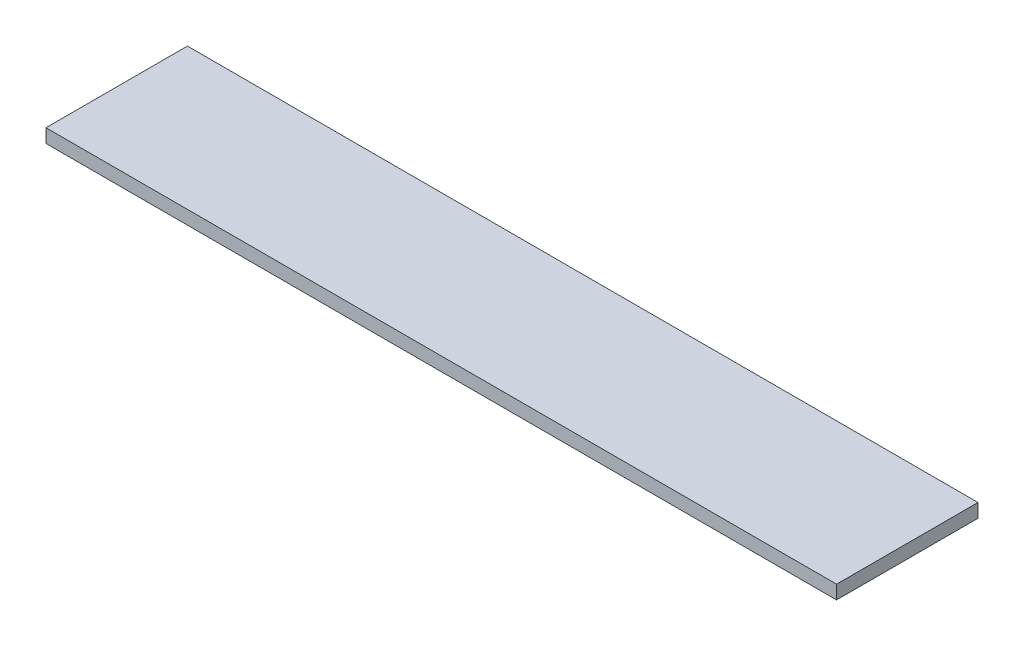
ISO-10303-21;
HEADER;
FILE_DESCRIPTION(('STEP AP214'),'2;1');
FILE_NAME('part.step','',(''),(''),'','','');
FILE_SCHEMA(('AUTOMOTIVE_DESIGN { 1 0 10303 214 1 1 1 1 }'));
ENDSEC;
DATA;
#1=APPLICATION_CONTEXT('core data for automotive mechanical design processes');
#2=APPLICATION_PROTOCOL_DEFINITION('international standard','automotive_design',2000,#1);
#3=PRODUCT_CONTEXT('',#1,'mechanical');
#4=PRODUCT('Part','Part','',(#3));
#5=PRODUCT_RELATED_PRODUCT_CATEGORY('part','',(#4));
#6=PRODUCT_DEFINITION_FORMATION('','',#4);
#7=PRODUCT_DEFINITION_CONTEXT('part definition',#1,'design');
#8=PRODUCT_DEFINITION('design','',#6,#7);
#9=PRODUCT_DEFINITION_SHAPE('','',#8);
#10=(LENGTH_UNIT() NAMED_UNIT(*) SI_UNIT(.MILLI.,.METRE.));
#11=(NAMED_UNIT(*) PLANE_ANGLE_UNIT() SI_UNIT($,.RADIAN.));
#12=(NAMED_UNIT(*) SI_UNIT($,.STERADIAN.) SOLID_ANGLE_UNIT());
#13=UNCERTAINTY_MEASURE_WITH_UNIT(LENGTH_MEASURE(1.E-05),#10,'distance_accuracy_value','');
#14=(GEOMETRIC_REPRESENTATION_CONTEXT(3) GLOBAL_UNCERTAINTY_ASSIGNED_CONTEXT((#13)) GLOBAL_UNIT_ASSIGNED_CONTEXT((#10,
#11,#12)) REPRESENTATION_CONTEXT('',''));
#15=CARTESIAN_POINT('',(0.,0.,0.));
#16=DIRECTION('',(0.,0.,1.));
#17=DIRECTION('',(1.,0.,0.));
#18=AXIS2_PLACEMENT_3D('',#15,#16,#17);
#19=CARTESIAN_POINT('',(57.85,2.,-10.35));
#20=DIRECTION('',(-1.,0.,0.));
#21=DIRECTION('',(0.,0.,1.));
#22=AXIS2_PLACEMENT_3D('',#19,#20,#21);
#23=PLANE('',#22);
#24=DIRECTION('',(0.,0.,-1.));
#25=VECTOR('',#24,1.);
#26=CARTESIAN_POINT('',(57.85,0.,-10.35));
#27=LINE('',#26,#25);
#28=CARTESIAN_POINT('',(57.85,0.,10.35));
#29=VERTEX_POINT('',#28);
#30=CARTESIAN_POINT('',(57.85,0.,-10.35));
#31=VERTEX_POINT('',#30);
#32=EDGE_CURVE('E98',#29,#31,#27,.T.);
#33=ORIENTED_EDGE('',*,*,#32,.T.);
#34=DIRECTION('',(0.,-1.,0.));
#35=VECTOR('',#34,1.);
#36=CARTESIAN_POINT('',(57.85,2.,-10.35));
#37=LINE('',#36,#35);
#38=CARTESIAN_POINT('',(57.85,2.,-10.35));
#39=VERTEX_POINT('',#38);
#40=EDGE_CURVE('E11',#39,#31,#37,.T.);
#41=ORIENTED_EDGE('',*,*,#40,.F.);
#42=DIRECTION('',(0.,0.,-1.));
#43=VECTOR('',#42,1.);
#44=CARTESIAN_POINT('',(57.85,2.,-10.35));
#45=LINE('',#44,#43);
#46=CARTESIAN_POINT('',(57.85,2.,10.35));
#47=VERTEX_POINT('',#46);
#48=EDGE_CURVE('E86',#47,#39,#45,.T.);
#49=ORIENTED_EDGE('',*,*,#48,.F.);
#50=DIRECTION('',(0.,-1.,0.));
#51=VECTOR('',#50,1.);
#52=CARTESIAN_POINT('',(57.85,2.,10.35));
#53=LINE('',#52,#51);
#54=EDGE_CURVE('E94',#47,#29,#53,.T.);
#55=ORIENTED_EDGE('',*,*,#54,.T.);
#56=EDGE_LOOP('',(#33,#41,#49,#55));
#57=FACE_BOUND('',#56,.T.);
#58=ADVANCED_FACE('F35',(#57),#23,.F.);
#59=CARTESIAN_POINT('',(-57.85,2.,-10.35));
#60=DIRECTION('',(0.,0.,1.));
#61=DIRECTION('',(1.,0.,0.));
#62=AXIS2_PLACEMENT_3D('',#59,#60,#61);
#63=PLANE('',#62);
#64=DIRECTION('',(-1.,0.,0.));
#65=VECTOR('',#64,1.);
#66=CARTESIAN_POINT('',(-57.85,0.,-10.35));
#67=LINE('',#66,#65);
#68=CARTESIAN_POINT('',(-57.85,0.,-10.35));
#69=VERTEX_POINT('',#68);
#70=EDGE_CURVE('E90',#31,#69,#67,.T.);
#71=ORIENTED_EDGE('',*,*,#70,.T.);
#72=DIRECTION('',(0.,-1.,0.));
#73=VECTOR('',#72,1.);
#74=CARTESIAN_POINT('',(-57.85,2.,-10.35));
#75=LINE('',#74,#73);
#76=CARTESIAN_POINT('',(-57.85,2.,-10.35));
#77=VERTEX_POINT('',#76);
#78=EDGE_CURVE('E43',#77,#69,#75,.T.);
#79=ORIENTED_EDGE('',*,*,#78,.F.);
#80=DIRECTION('',(-1.,0.,0.));
#81=VECTOR('',#80,1.);
#82=CARTESIAN_POINT('',(-57.85,2.,-10.35));
#83=LINE('',#82,#81);
#84=EDGE_CURVE('E81',#39,#77,#83,.T.);
#85=ORIENTED_EDGE('',*,*,#84,.F.);
#86=ORIENTED_EDGE('',*,*,#40,.T.);
#87=EDGE_LOOP('',(#71,#79,#85,#86));
#88=FACE_BOUND('',#87,.T.);
#89=ADVANCED_FACE('F89',(#88),#63,.F.);
#90=CARTESIAN_POINT('',(-57.85,2.,-10.35));
#91=DIRECTION('',(1.,0.,0.));
#92=DIRECTION('',(0.,0.,-1.));
#93=AXIS2_PLACEMENT_3D('',#90,#91,#92);
#94=PLANE('',#93);
#95=DIRECTION('',(0.,0.,1.));
#96=VECTOR('',#95,1.);
#97=CARTESIAN_POINT('',(-57.85,0.,-10.35));
#98=LINE('',#97,#96);
#99=CARTESIAN_POINT('',(-57.85,0.,10.35));
#100=VERTEX_POINT('',#99);
#101=EDGE_CURVE('E68',#69,#100,#98,.T.);
#102=ORIENTED_EDGE('',*,*,#101,.T.);
#103=DIRECTION('',(0.,-1.,0.));
#104=VECTOR('',#103,1.);
#105=CARTESIAN_POINT('',(-57.85,2.,10.35));
#106=LINE('',#105,#104);
#107=CARTESIAN_POINT('',(-57.85,2.,10.35));
#108=VERTEX_POINT('',#107);
#109=EDGE_CURVE('E91',#108,#100,#106,.T.);
#110=ORIENTED_EDGE('',*,*,#109,.F.);
#111=DIRECTION('',(0.,0.,1.));
#112=VECTOR('',#111,1.);
#113=CARTESIAN_POINT('',(-57.85,2.,-10.35));
#114=LINE('',#113,#112);
#115=EDGE_CURVE('E84',#77,#108,#114,.T.);
#116=ORIENTED_EDGE('',*,*,#115,.F.);
#117=ORIENTED_EDGE('',*,*,#78,.T.);
#118=EDGE_LOOP('',(#102,#110,#116,#117));
#119=FACE_BOUND('',#118,.T.);
#120=ADVANCED_FACE('F92',(#119),#94,.F.);
#121=CARTESIAN_POINT('',(-57.85,2.,10.35));
#122=DIRECTION('',(0.,0.,-1.));
#123=DIRECTION('',(-1.,0.,0.));
#124=AXIS2_PLACEMENT_3D('',#121,#122,#123);
#125=PLANE('',#124);
#126=DIRECTION('',(1.,0.,0.));
#127=VECTOR('',#126,1.);
#128=CARTESIAN_POINT('',(-57.85,0.,10.35));
#129=LINE('',#128,#127);
#130=EDGE_CURVE('E74',#100,#29,#129,.T.);
#131=ORIENTED_EDGE('',*,*,#130,.T.);
#132=ORIENTED_EDGE('',*,*,#54,.F.);
#133=DIRECTION('',(1.,0.,0.));
#134=VECTOR('',#133,1.);
#135=CARTESIAN_POINT('',(-57.85,2.,10.35));
#136=LINE('',#135,#134);
#137=EDGE_CURVE('E51',#108,#47,#136,.T.);
#138=ORIENTED_EDGE('',*,*,#137,.F.);
#139=ORIENTED_EDGE('',*,*,#109,.T.);
#140=EDGE_LOOP('',(#131,#132,#138,#139));
#141=FACE_BOUND('',#140,.T.);
#142=ADVANCED_FACE('F105',(#141),#125,.F.);
#143=CARTESIAN_POINT('',(0.,2.,0.));
#144=DIRECTION('',(0.,1.,0.));
#145=DIRECTION('',(0.,0.,1.));
#146=AXIS2_PLACEMENT_3D('',#143,#144,#145);
#147=PLANE('',#146);
#148=ORIENTED_EDGE('',*,*,#48,.T.);
#149=ORIENTED_EDGE('',*,*,#84,.T.);
#150=ORIENTED_EDGE('',*,*,#115,.T.);
#151=ORIENTED_EDGE('',*,*,#137,.T.);
#152=EDGE_LOOP('',(#148,#149,#150,#151));
#153=FACE_BOUND('',#152,.T.);
#154=ADVANCED_FACE('F82',(#153),#147,.T.);
#155=CARTESIAN_POINT('',(0.,0.,0.));
#156=DIRECTION('',(0.,1.,0.));
#157=DIRECTION('',(0.,0.,1.));
#158=AXIS2_PLACEMENT_3D('',#155,#156,#157);
#159=PLANE('',#158);
#160=ORIENTED_EDGE('',*,*,#32,.F.);
#161=ORIENTED_EDGE('',*,*,#130,.F.);
#162=ORIENTED_EDGE('',*,*,#101,.F.);
#163=ORIENTED_EDGE('',*,*,#70,.F.);
#164=EDGE_LOOP('',(#160,#161,#162,#163));
#165=FACE_BOUND('',#164,.T.);
#166=ADVANCED_FACE('F108',(#165),#159,.F.);
#167=CLOSED_SHELL('',(#58,#89,#120,#142,#154,#166));
#168=MANIFOLD_SOLID_BREP('B2',#167);
#169=ADVANCED_BREP_SHAPE_REPRESENTATION('',(#18,#168),#14);
#170=SHAPE_DEFINITION_REPRESENTATION(#9,#169);
ENDSEC;
END-ISO-10303-21;
